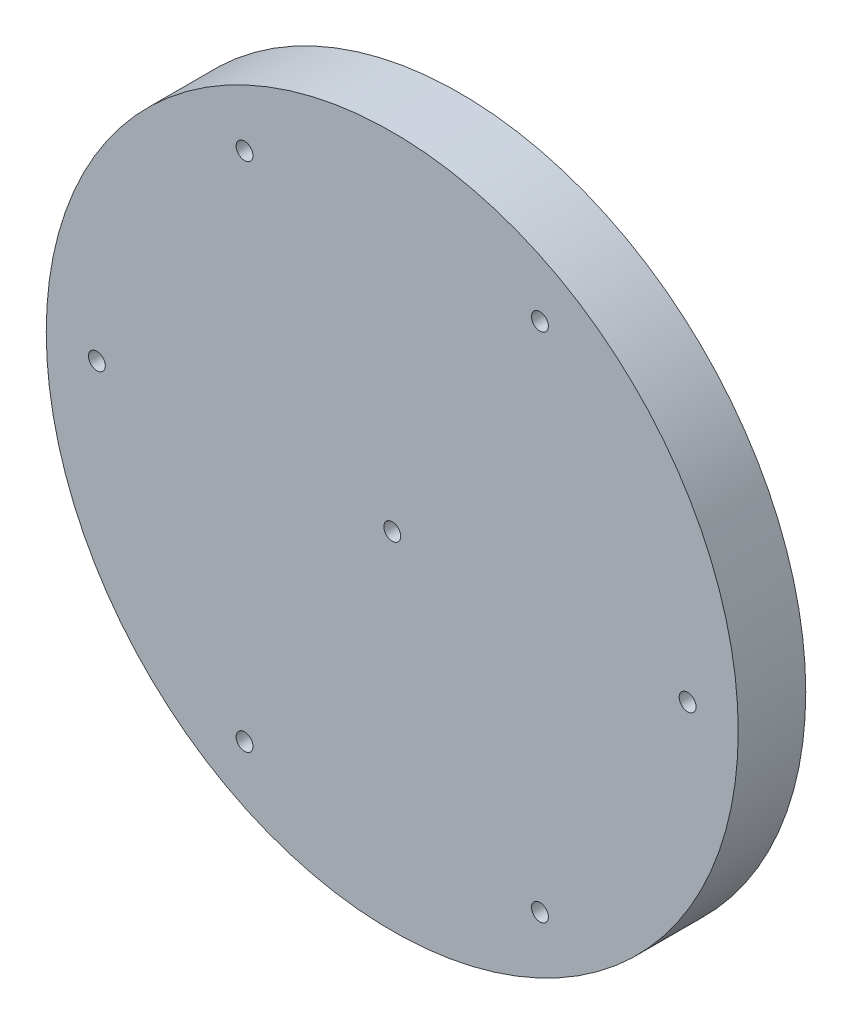
ISO-10303-21;
HEADER;
FILE_DESCRIPTION(('STEP AP214'),'2;1');
FILE_NAME('part.step','',(''),(''),'','','');
FILE_SCHEMA(('AUTOMOTIVE_DESIGN { 1 0 10303 214 1 1 1 1 }'));
ENDSEC;
DATA;
#1=APPLICATION_CONTEXT('core data for automotive mechanical design processes');
#2=APPLICATION_PROTOCOL_DEFINITION('international standard','automotive_design',2000,#1);
#3=PRODUCT_CONTEXT('',#1,'mechanical');
#4=PRODUCT('Part','Part','',(#3));
#5=PRODUCT_RELATED_PRODUCT_CATEGORY('part','',(#4));
#6=PRODUCT_DEFINITION_FORMATION('','',#4);
#7=PRODUCT_DEFINITION_CONTEXT('part definition',#1,'design');
#8=PRODUCT_DEFINITION('design','',#6,#7);
#9=PRODUCT_DEFINITION_SHAPE('','',#8);
#10=(LENGTH_UNIT() NAMED_UNIT(*) SI_UNIT(.MILLI.,.METRE.));
#11=(NAMED_UNIT(*) PLANE_ANGLE_UNIT() SI_UNIT($,.RADIAN.));
#12=(NAMED_UNIT(*) SI_UNIT($,.STERADIAN.) SOLID_ANGLE_UNIT());
#13=UNCERTAINTY_MEASURE_WITH_UNIT(LENGTH_MEASURE(1.E-05),#10,'distance_accuracy_value','');
#14=(GEOMETRIC_REPRESENTATION_CONTEXT(3) GLOBAL_UNCERTAINTY_ASSIGNED_CONTEXT((#13)) GLOBAL_UNIT_ASSIGNED_CONTEXT((#10,
#11,#12)) REPRESENTATION_CONTEXT('',''));
#15=CARTESIAN_POINT('',(0.,0.,0.));
#16=DIRECTION('',(0.,0.,1.));
#17=DIRECTION('',(1.,0.,0.));
#18=AXIS2_PLACEMENT_3D('',#15,#16,#17);
#19=CARTESIAN_POINT('',(2103.99445719508,1410.06323130397,4.));
#20=DIRECTION('',(0.,0.,1.));
#21=DIRECTION('',(1.,0.,0.));
#22=AXIS2_PLACEMENT_3D('',#19,#20,#21);
#23=PLANE('',#22);
#24=CARTESIAN_POINT('',(2095.24445719508,1394.90778673774,4.));
#25=DIRECTION('',(0.,0.,1.));
#26=DIRECTION('',(1.,0.,0.));
#27=AXIS2_PLACEMENT_3D('',#24,#25,#26);
#28=CIRCLE('',#27,0.500000000000167);
#29=CARTESIAN_POINT('',(2095.74445719508,1394.90778673774,4.));
#30=VERTEX_POINT('',#29);
#31=EDGE_CURVE('E70',#30,#30,#28,.T.);
#32=ORIENTED_EDGE('',*,*,#31,.F.);
#33=EDGE_LOOP('',(#32));
#34=FACE_BOUND('',#33,.T.);
#35=CARTESIAN_POINT('',(2095.24445719508,1425.21867587019,4.));
#36=DIRECTION('',(0.,0.,1.));
#37=DIRECTION('',(1.,0.,0.));
#38=AXIS2_PLACEMENT_3D('',#35,#36,#37);
#39=CIRCLE('',#38,0.500000000000167);
#40=CARTESIAN_POINT('',(2095.74445719508,1425.21867587019,4.));
#41=VERTEX_POINT('',#40);
#42=EDGE_CURVE('E58',#41,#41,#39,.T.);
#43=ORIENTED_EDGE('',*,*,#42,.F.);
#44=EDGE_LOOP('',(#43));
#45=FACE_BOUND('',#44,.T.);
#46=CARTESIAN_POINT('',(2121.49445719508,1410.06323130397,4.));
#47=DIRECTION('',(0.,0.,1.));
#48=DIRECTION('',(1.,0.,0.));
#49=AXIS2_PLACEMENT_3D('',#46,#47,#48);
#50=CIRCLE('',#49,0.500000000000167);
#51=CARTESIAN_POINT('',(2121.99445719508,1410.06323130397,4.));
#52=VERTEX_POINT('',#51);
#53=EDGE_CURVE('E46',#52,#52,#50,.T.);
#54=ORIENTED_EDGE('',*,*,#53,.F.);
#55=EDGE_LOOP('',(#54));
#56=FACE_BOUND('',#55,.T.);
#57=CARTESIAN_POINT('',(2103.99445719508,1410.06323130397,4.));
#58=DIRECTION('',(0.,0.,1.));
#59=DIRECTION('',(1.,0.,0.));
#60=AXIS2_PLACEMENT_3D('',#57,#58,#59);
#61=CIRCLE('',#60,20.5000000000002);
#62=CARTESIAN_POINT('',(2124.49445719508,1410.06323130397,4.));
#63=VERTEX_POINT('',#62);
#64=EDGE_CURVE('E10',#63,#63,#61,.T.);
#65=ORIENTED_EDGE('',*,*,#64,.T.);
#66=EDGE_LOOP('',(#65));
#67=FACE_BOUND('',#66,.T.);
#68=CARTESIAN_POINT('',(2103.99445719508,1410.06323130397,4.));
#69=DIRECTION('',(0.,0.,1.));
#70=DIRECTION('',(1.,0.,0.));
#71=AXIS2_PLACEMENT_3D('',#68,#69,#70);
#72=CIRCLE('',#71,0.500000000000167);
#73=CARTESIAN_POINT('',(2104.49445719508,1410.06323130397,4.));
#74=VERTEX_POINT('',#73);
#75=EDGE_CURVE('E41',#74,#74,#72,.T.);
#76=ORIENTED_EDGE('',*,*,#75,.F.);
#77=EDGE_LOOP('',(#76));
#78=FACE_BOUND('',#77,.T.);
#79=CARTESIAN_POINT('',(2112.74445719508,1425.21867587019,4.));
#80=DIRECTION('',(0.,0.,1.));
#81=DIRECTION('',(1.,0.,0.));
#82=AXIS2_PLACEMENT_3D('',#79,#80,#81);
#83=CIRCLE('',#82,0.500000000000167);
#84=CARTESIAN_POINT('',(2113.24445719508,1425.21867587019,4.));
#85=VERTEX_POINT('',#84);
#86=EDGE_CURVE('E52',#85,#85,#83,.T.);
#87=ORIENTED_EDGE('',*,*,#86,.F.);
#88=EDGE_LOOP('',(#87));
#89=FACE_BOUND('',#88,.T.);
#90=CARTESIAN_POINT('',(2086.49445719508,1410.06323130397,4.));
#91=DIRECTION('',(0.,0.,1.));
#92=DIRECTION('',(1.,0.,0.));
#93=AXIS2_PLACEMENT_3D('',#90,#91,#92);
#94=CIRCLE('',#93,0.500000000000167);
#95=CARTESIAN_POINT('',(2086.99445719508,1410.06323130397,4.));
#96=VERTEX_POINT('',#95);
#97=EDGE_CURVE('E64',#96,#96,#94,.T.);
#98=ORIENTED_EDGE('',*,*,#97,.F.);
#99=EDGE_LOOP('',(#98));
#100=FACE_BOUND('',#99,.T.);
#101=CARTESIAN_POINT('',(2112.74445719508,1394.90778673774,4.));
#102=DIRECTION('',(0.,0.,1.));
#103=DIRECTION('',(1.,0.,0.));
#104=AXIS2_PLACEMENT_3D('',#101,#102,#103);
#105=CIRCLE('',#104,0.500000000000167);
#106=CARTESIAN_POINT('',(2113.24445719508,1394.90778673774,4.));
#107=VERTEX_POINT('',#106);
#108=EDGE_CURVE('E76',#107,#107,#105,.T.);
#109=ORIENTED_EDGE('',*,*,#108,.F.);
#110=EDGE_LOOP('',(#109));
#111=FACE_BOUND('',#110,.T.);
#112=ADVANCED_FACE('F30',(#34,#45,#56,#67,#78,#89,#100,#111),#23,.T.);
#113=CARTESIAN_POINT('',(2103.99445719508,1410.06323130397,0.));
#114=DIRECTION('',(0.,0.,1.));
#115=DIRECTION('',(1.,0.,0.));
#116=AXIS2_PLACEMENT_3D('',#113,#114,#115);
#117=PLANE('',#116);
#118=CARTESIAN_POINT('',(2095.24445719508,1394.90778673774,0.));
#119=DIRECTION('',(0.,0.,1.));
#120=DIRECTION('',(1.,0.,0.));
#121=AXIS2_PLACEMENT_3D('',#118,#119,#120);
#122=CIRCLE('',#121,0.500000000000167);
#123=CARTESIAN_POINT('',(2095.74445719508,1394.90778673774,0.));
#124=VERTEX_POINT('',#123);
#125=EDGE_CURVE('E73',#124,#124,#122,.T.);
#126=ORIENTED_EDGE('',*,*,#125,.T.);
#127=EDGE_LOOP('',(#126));
#128=FACE_BOUND('',#127,.T.);
#129=CARTESIAN_POINT('',(2095.24445719508,1425.21867587019,0.));
#130=DIRECTION('',(0.,0.,1.));
#131=DIRECTION('',(1.,0.,0.));
#132=AXIS2_PLACEMENT_3D('',#129,#130,#131);
#133=CIRCLE('',#132,0.500000000000167);
#134=CARTESIAN_POINT('',(2095.74445719508,1425.21867587019,0.));
#135=VERTEX_POINT('',#134);
#136=EDGE_CURVE('E61',#135,#135,#133,.T.);
#137=ORIENTED_EDGE('',*,*,#136,.T.);
#138=EDGE_LOOP('',(#137));
#139=FACE_BOUND('',#138,.T.);
#140=CARTESIAN_POINT('',(2121.49445719508,1410.06323130397,0.));
#141=DIRECTION('',(0.,0.,1.));
#142=DIRECTION('',(1.,0.,0.));
#143=AXIS2_PLACEMENT_3D('',#140,#141,#142);
#144=CIRCLE('',#143,0.500000000000167);
#145=CARTESIAN_POINT('',(2121.99445719508,1410.06323130397,0.));
#146=VERTEX_POINT('',#145);
#147=EDGE_CURVE('E49',#146,#146,#144,.T.);
#148=ORIENTED_EDGE('',*,*,#147,.T.);
#149=EDGE_LOOP('',(#148));
#150=FACE_BOUND('',#149,.T.);
#151=CARTESIAN_POINT('',(2103.99445719508,1410.06323130397,0.));
#152=DIRECTION('',(0.,0.,1.));
#153=DIRECTION('',(1.,0.,0.));
#154=AXIS2_PLACEMENT_3D('',#151,#152,#153);
#155=CIRCLE('',#154,20.5000000000002);
#156=CARTESIAN_POINT('',(2124.49445719508,1410.06323130397,0.));
#157=VERTEX_POINT('',#156);
#158=EDGE_CURVE('E34',#157,#157,#155,.T.);
#159=ORIENTED_EDGE('',*,*,#158,.F.);
#160=EDGE_LOOP('',(#159));
#161=FACE_BOUND('',#160,.T.);
#162=CARTESIAN_POINT('',(2103.99445719508,1410.06323130397,0.));
#163=DIRECTION('',(0.,0.,1.));
#164=DIRECTION('',(1.,0.,0.));
#165=AXIS2_PLACEMENT_3D('',#162,#163,#164);
#166=CIRCLE('',#165,0.500000000000167);
#167=CARTESIAN_POINT('',(2104.49445719508,1410.06323130397,0.));
#168=VERTEX_POINT('',#167);
#169=EDGE_CURVE('E43',#168,#168,#166,.T.);
#170=ORIENTED_EDGE('',*,*,#169,.T.);
#171=EDGE_LOOP('',(#170));
#172=FACE_BOUND('',#171,.T.);
#173=CARTESIAN_POINT('',(2112.74445719508,1425.21867587019,0.));
#174=DIRECTION('',(0.,0.,1.));
#175=DIRECTION('',(1.,0.,0.));
#176=AXIS2_PLACEMENT_3D('',#173,#174,#175);
#177=CIRCLE('',#176,0.500000000000167);
#178=CARTESIAN_POINT('',(2113.24445719508,1425.21867587019,0.));
#179=VERTEX_POINT('',#178);
#180=EDGE_CURVE('E55',#179,#179,#177,.T.);
#181=ORIENTED_EDGE('',*,*,#180,.T.);
#182=EDGE_LOOP('',(#181));
#183=FACE_BOUND('',#182,.T.);
#184=CARTESIAN_POINT('',(2086.49445719508,1410.06323130397,0.));
#185=DIRECTION('',(0.,0.,1.));
#186=DIRECTION('',(1.,0.,0.));
#187=AXIS2_PLACEMENT_3D('',#184,#185,#186);
#188=CIRCLE('',#187,0.500000000000167);
#189=CARTESIAN_POINT('',(2086.99445719508,1410.06323130397,0.));
#190=VERTEX_POINT('',#189);
#191=EDGE_CURVE('E67',#190,#190,#188,.T.);
#192=ORIENTED_EDGE('',*,*,#191,.T.);
#193=EDGE_LOOP('',(#192));
#194=FACE_BOUND('',#193,.T.);
#195=CARTESIAN_POINT('',(2112.74445719508,1394.90778673774,0.));
#196=DIRECTION('',(0.,0.,1.));
#197=DIRECTION('',(1.,0.,0.));
#198=AXIS2_PLACEMENT_3D('',#195,#196,#197);
#199=CIRCLE('',#198,0.500000000000167);
#200=CARTESIAN_POINT('',(2113.24445719508,1394.90778673774,0.));
#201=VERTEX_POINT('',#200);
#202=EDGE_CURVE('E79',#201,#201,#199,.T.);
#203=ORIENTED_EDGE('',*,*,#202,.T.);
#204=EDGE_LOOP('',(#203));
#205=FACE_BOUND('',#204,.T.);
#206=ADVANCED_FACE('F89',(#128,#139,#150,#161,#172,#183,#194,#205),#117,.F.);
#207=CARTESIAN_POINT('',(2103.99445719508,1410.06323130397,4.));
#208=DIRECTION('',(0.,0.,-1.));
#209=DIRECTION('',(-1.,0.,0.));
#210=AXIS2_PLACEMENT_3D('',#207,#208,#209);
#211=CYLINDRICAL_SURFACE('',#210,20.5000000000002);
#212=ORIENTED_EDGE('',*,*,#64,.F.);
#213=EDGE_LOOP('',(#212));
#214=FACE_BOUND('',#213,.T.);
#215=ORIENTED_EDGE('',*,*,#158,.T.);
#216=EDGE_LOOP('',(#215));
#217=FACE_BOUND('',#216,.T.);
#218=ADVANCED_FACE('F32',(#214,#217),#211,.T.);
#219=CARTESIAN_POINT('',(2103.99445719508,1410.06323130397,4.));
#220=DIRECTION('',(0.,0.,-1.));
#221=DIRECTION('',(-1.,0.,0.));
#222=AXIS2_PLACEMENT_3D('',#219,#220,#221);
#223=CYLINDRICAL_SURFACE('',#222,0.500000000000167);
#224=ORIENTED_EDGE('',*,*,#75,.T.);
#225=EDGE_LOOP('',(#224));
#226=FACE_BOUND('',#225,.T.);
#227=ORIENTED_EDGE('',*,*,#169,.F.);
#228=EDGE_LOOP('',(#227));
#229=FACE_BOUND('',#228,.T.);
#230=ADVANCED_FACE('F99',(#226,#229),#223,.F.);
#231=CARTESIAN_POINT('',(2121.49445719508,1410.06323130397,4.));
#232=DIRECTION('',(0.,0.,-1.));
#233=DIRECTION('',(-1.,0.,0.));
#234=AXIS2_PLACEMENT_3D('',#231,#232,#233);
#235=CYLINDRICAL_SURFACE('',#234,0.500000000000167);
#236=ORIENTED_EDGE('',*,*,#53,.T.);
#237=EDGE_LOOP('',(#236));
#238=FACE_BOUND('',#237,.T.);
#239=ORIENTED_EDGE('',*,*,#147,.F.);
#240=EDGE_LOOP('',(#239));
#241=FACE_BOUND('',#240,.T.);
#242=ADVANCED_FACE('F102',(#238,#241),#235,.F.);
#243=CARTESIAN_POINT('',(2112.74445719508,1425.21867587019,4.));
#244=DIRECTION('',(0.,0.,-1.));
#245=DIRECTION('',(-1.,0.,0.));
#246=AXIS2_PLACEMENT_3D('',#243,#244,#245);
#247=CYLINDRICAL_SURFACE('',#246,0.500000000000167);
#248=ORIENTED_EDGE('',*,*,#86,.T.);
#249=EDGE_LOOP('',(#248));
#250=FACE_BOUND('',#249,.T.);
#251=ORIENTED_EDGE('',*,*,#180,.F.);
#252=EDGE_LOOP('',(#251));
#253=FACE_BOUND('',#252,.T.);
#254=ADVANCED_FACE('F106',(#250,#253),#247,.F.);
#255=CARTESIAN_POINT('',(2095.24445719508,1425.21867587019,4.));
#256=DIRECTION('',(0.,0.,-1.));
#257=DIRECTION('',(-1.,0.,0.));
#258=AXIS2_PLACEMENT_3D('',#255,#256,#257);
#259=CYLINDRICAL_SURFACE('',#258,0.500000000000167);
#260=ORIENTED_EDGE('',*,*,#42,.T.);
#261=EDGE_LOOP('',(#260));
#262=FACE_BOUND('',#261,.T.);
#263=ORIENTED_EDGE('',*,*,#136,.F.);
#264=EDGE_LOOP('',(#263));
#265=FACE_BOUND('',#264,.T.);
#266=ADVANCED_FACE('F110',(#262,#265),#259,.F.);
#267=CARTESIAN_POINT('',(2086.49445719508,1410.06323130397,4.));
#268=DIRECTION('',(0.,0.,-1.));
#269=DIRECTION('',(-1.,0.,0.));
#270=AXIS2_PLACEMENT_3D('',#267,#268,#269);
#271=CYLINDRICAL_SURFACE('',#270,0.500000000000167);
#272=ORIENTED_EDGE('',*,*,#97,.T.);
#273=EDGE_LOOP('',(#272));
#274=FACE_BOUND('',#273,.T.);
#275=ORIENTED_EDGE('',*,*,#191,.F.);
#276=EDGE_LOOP('',(#275));
#277=FACE_BOUND('',#276,.T.);
#278=ADVANCED_FACE('F114',(#274,#277),#271,.F.);
#279=CARTESIAN_POINT('',(2095.24445719508,1394.90778673774,4.));
#280=DIRECTION('',(0.,0.,-1.));
#281=DIRECTION('',(-1.,0.,0.));
#282=AXIS2_PLACEMENT_3D('',#279,#280,#281);
#283=CYLINDRICAL_SURFACE('',#282,0.500000000000167);
#284=ORIENTED_EDGE('',*,*,#31,.T.);
#285=EDGE_LOOP('',(#284));
#286=FACE_BOUND('',#285,.T.);
#287=ORIENTED_EDGE('',*,*,#125,.F.);
#288=EDGE_LOOP('',(#287));
#289=FACE_BOUND('',#288,.T.);
#290=ADVANCED_FACE('F118',(#286,#289),#283,.F.);
#291=CARTESIAN_POINT('',(2112.74445719508,1394.90778673774,4.));
#292=DIRECTION('',(0.,0.,-1.));
#293=DIRECTION('',(-1.,0.,0.));
#294=AXIS2_PLACEMENT_3D('',#291,#292,#293);
#295=CYLINDRICAL_SURFACE('',#294,0.500000000000167);
#296=ORIENTED_EDGE('',*,*,#108,.T.);
#297=EDGE_LOOP('',(#296));
#298=FACE_BOUND('',#297,.T.);
#299=ORIENTED_EDGE('',*,*,#202,.F.);
#300=EDGE_LOOP('',(#299));
#301=FACE_BOUND('',#300,.T.);
#302=ADVANCED_FACE('F85',(#298,#301),#295,.F.);
#303=CLOSED_SHELL('',(#112,#206,#218,#230,#242,#254,#266,#278,#290,#302));
#304=MANIFOLD_SOLID_BREP('B2',#303);
#305=ADVANCED_BREP_SHAPE_REPRESENTATION('',(#18,#304),#14);
#306=SHAPE_DEFINITION_REPRESENTATION(#9,#305);
ENDSEC;
END-ISO-10303-21;
